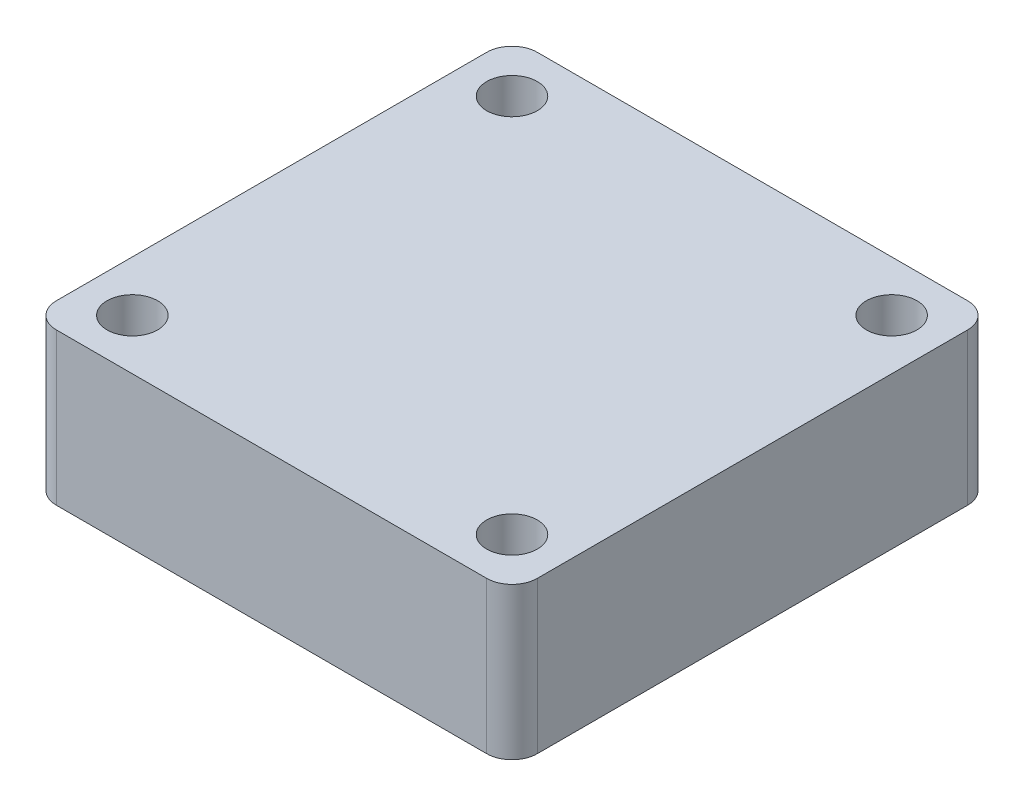
ISO-10303-21;
HEADER;
FILE_DESCRIPTION(('STEP AP214'),'2;1');
FILE_NAME('part.step','',(''),(''),'','','');
FILE_SCHEMA(('AUTOMOTIVE_DESIGN { 1 0 10303 214 1 1 1 1 }'));
ENDSEC;
DATA;
#1=APPLICATION_CONTEXT('core data for automotive mechanical design processes');
#2=APPLICATION_PROTOCOL_DEFINITION('international standard','automotive_design',2000,#1);
#3=PRODUCT_CONTEXT('',#1,'mechanical');
#4=PRODUCT('Part','Part','',(#3));
#5=PRODUCT_RELATED_PRODUCT_CATEGORY('part','',(#4));
#6=PRODUCT_DEFINITION_FORMATION('','',#4);
#7=PRODUCT_DEFINITION_CONTEXT('part definition',#1,'design');
#8=PRODUCT_DEFINITION('design','',#6,#7);
#9=PRODUCT_DEFINITION_SHAPE('','',#8);
#10=(LENGTH_UNIT() NAMED_UNIT(*) SI_UNIT(.MILLI.,.METRE.));
#11=(NAMED_UNIT(*) PLANE_ANGLE_UNIT() SI_UNIT($,.RADIAN.));
#12=(NAMED_UNIT(*) SI_UNIT($,.STERADIAN.) SOLID_ANGLE_UNIT());
#13=UNCERTAINTY_MEASURE_WITH_UNIT(LENGTH_MEASURE(1.E-05),#10,'distance_accuracy_value','');
#14=(GEOMETRIC_REPRESENTATION_CONTEXT(3) GLOBAL_UNCERTAINTY_ASSIGNED_CONTEXT((#13)) GLOBAL_UNIT_ASSIGNED_CONTEXT((#10,
#11,#12)) REPRESENTATION_CONTEXT('',''));
#15=CARTESIAN_POINT('',(0.,0.,0.));
#16=DIRECTION('',(0.,0.,1.));
#17=DIRECTION('',(1.,0.,0.));
#18=AXIS2_PLACEMENT_3D('',#15,#16,#17);
#19=CARTESIAN_POINT('',(0.,6.,0.));
#20=DIRECTION('',(0.,-1.,0.));
#21=DIRECTION('',(0.,0.,-1.));
#22=AXIS2_PLACEMENT_3D('',#19,#20,#21);
#23=PLANE('',#22);
#24=DIRECTION('',(1.,0.,0.));
#25=VECTOR('',#24,1.);
#26=CARTESIAN_POINT('',(0.,6.,0.));
#27=LINE('',#26,#25);
#28=CARTESIAN_POINT('',(1.,6.,0.));
#29=VERTEX_POINT('',#28);
#30=CARTESIAN_POINT('',(18.,6.,0.));
#31=VERTEX_POINT('',#30);
#32=EDGE_CURVE('E171',#29,#31,#27,.T.);
#33=ORIENTED_EDGE('',*,*,#32,.T.);
#34=CARTESIAN_POINT('',(18.,6.,-1.));
#35=DIRECTION('',(0.,-1.,0.));
#36=DIRECTION('',(0.,0.,-1.));
#37=AXIS2_PLACEMENT_3D('',#34,#35,#36);
#38=CIRCLE('',#37,1.);
#39=CARTESIAN_POINT('',(19.,6.,-1.));
#40=VERTEX_POINT('',#39);
#41=EDGE_CURVE('E149',#31,#40,#38,.F.);
#42=ORIENTED_EDGE('',*,*,#41,.T.);
#43=DIRECTION('',(0.,0.,-1.));
#44=VECTOR('',#43,1.);
#45=CARTESIAN_POINT('',(19.,6.,0.));
#46=LINE('',#45,#44);
#47=CARTESIAN_POINT('',(19.,6.,-18.));
#48=VERTEX_POINT('',#47);
#49=EDGE_CURVE('E119',#40,#48,#46,.T.);
#50=ORIENTED_EDGE('',*,*,#49,.T.);
#51=CARTESIAN_POINT('',(18.,6.,-18.));
#52=DIRECTION('',(0.,-1.,0.));
#53=DIRECTION('',(0.,0.,-1.));
#54=AXIS2_PLACEMENT_3D('',#51,#52,#53);
#55=CIRCLE('',#54,1.);
#56=CARTESIAN_POINT('',(18.,6.,-19.));
#57=VERTEX_POINT('',#56);
#58=EDGE_CURVE('E55',#48,#57,#55,.F.);
#59=ORIENTED_EDGE('',*,*,#58,.T.);
#60=DIRECTION('',(-1.,0.,0.));
#61=VECTOR('',#60,1.);
#62=CARTESIAN_POINT('',(0.,6.,-19.));
#63=LINE('',#62,#61);
#64=CARTESIAN_POINT('',(1.,6.,-19.));
#65=VERTEX_POINT('',#64);
#66=EDGE_CURVE('E135',#57,#65,#63,.T.);
#67=ORIENTED_EDGE('',*,*,#66,.T.);
#68=CARTESIAN_POINT('',(1.,6.,-18.));
#69=DIRECTION('',(0.,-1.,0.));
#70=DIRECTION('',(0.,0.,-1.));
#71=AXIS2_PLACEMENT_3D('',#68,#69,#70);
#72=CIRCLE('',#71,1.);
#73=CARTESIAN_POINT('',(0.,6.,-18.));
#74=VERTEX_POINT('',#73);
#75=EDGE_CURVE('E145',#65,#74,#72,.F.);
#76=ORIENTED_EDGE('',*,*,#75,.T.);
#77=DIRECTION('',(0.,0.,1.));
#78=VECTOR('',#77,1.);
#79=CARTESIAN_POINT('',(0.,6.,0.));
#80=LINE('',#79,#78);
#81=CARTESIAN_POINT('',(0.,6.,-1.));
#82=VERTEX_POINT('',#81);
#83=EDGE_CURVE('E129',#74,#82,#80,.T.);
#84=ORIENTED_EDGE('',*,*,#83,.T.);
#85=CARTESIAN_POINT('',(1.,6.,-1.));
#86=DIRECTION('',(0.,-1.,0.));
#87=DIRECTION('',(0.,0.,-1.));
#88=AXIS2_PLACEMENT_3D('',#85,#86,#87);
#89=CIRCLE('',#88,1.);
#90=EDGE_CURVE('E147',#82,#29,#89,.F.);
#91=ORIENTED_EDGE('',*,*,#90,.T.);
#92=EDGE_LOOP('',(#33,#42,#50,#59,#67,#76,#84,#91));
#93=FACE_BOUND('',#92,.T.);
#94=CARTESIAN_POINT('',(2.,6.,-17.));
#95=DIRECTION('',(0.,1.,0.));
#96=DIRECTION('',(0.,0.,1.));
#97=AXIS2_PLACEMENT_3D('',#94,#95,#96);
#98=CIRCLE('',#97,1.);
#99=CARTESIAN_POINT('',(2.,6.,-16.));
#100=VERTEX_POINT('',#99);
#101=EDGE_CURVE('E180',#100,#100,#98,.T.);
#102=ORIENTED_EDGE('',*,*,#101,.F.);
#103=EDGE_LOOP('',(#102));
#104=FACE_BOUND('',#103,.T.);
#105=CARTESIAN_POINT('',(17.,6.,-17.));
#106=DIRECTION('',(0.,1.,0.));
#107=DIRECTION('',(0.,0.,1.));
#108=AXIS2_PLACEMENT_3D('',#105,#106,#107);
#109=CIRCLE('',#108,0.999999999999998);
#110=CARTESIAN_POINT('',(17.,6.,-16.));
#111=VERTEX_POINT('',#110);
#112=EDGE_CURVE('E185',#111,#111,#109,.T.);
#113=ORIENTED_EDGE('',*,*,#112,.F.);
#114=EDGE_LOOP('',(#113));
#115=FACE_BOUND('',#114,.T.);
#116=CARTESIAN_POINT('',(17.,6.,-2.));
#117=DIRECTION('',(0.,1.,0.));
#118=DIRECTION('',(0.,0.,1.));
#119=AXIS2_PLACEMENT_3D('',#116,#117,#118);
#120=CIRCLE('',#119,0.999999999999998);
#121=CARTESIAN_POINT('',(17.,6.,-1.));
#122=VERTEX_POINT('',#121);
#123=EDGE_CURVE('E190',#122,#122,#120,.T.);
#124=ORIENTED_EDGE('',*,*,#123,.F.);
#125=EDGE_LOOP('',(#124));
#126=FACE_BOUND('',#125,.T.);
#127=CARTESIAN_POINT('',(2.,6.,-2.));
#128=DIRECTION('',(0.,1.,0.));
#129=DIRECTION('',(0.,0.,1.));
#130=AXIS2_PLACEMENT_3D('',#127,#128,#129);
#131=CIRCLE('',#130,1.);
#132=CARTESIAN_POINT('',(2.,6.,-1.));
#133=VERTEX_POINT('',#132);
#134=EDGE_CURVE('E196',#133,#133,#131,.T.);
#135=ORIENTED_EDGE('',*,*,#134,.F.);
#136=EDGE_LOOP('',(#135));
#137=FACE_BOUND('',#136,.T.);
#138=ADVANCED_FACE('F35',(#93,#104,#115,#126,#137),#23,.F.);
#139=CARTESIAN_POINT('',(0.,0.,0.));
#140=DIRECTION('',(0.,-1.,0.));
#141=DIRECTION('',(0.,0.,-1.));
#142=AXIS2_PLACEMENT_3D('',#139,#140,#141);
#143=PLANE('',#142);
#144=CARTESIAN_POINT('',(17.,0.,-2.));
#145=DIRECTION('',(0.,1.,0.));
#146=DIRECTION('',(0.,0.,1.));
#147=AXIS2_PLACEMENT_3D('',#144,#145,#146);
#148=CIRCLE('',#147,0.999999999999998);
#149=CARTESIAN_POINT('',(17.,0.,-1.));
#150=VERTEX_POINT('',#149);
#151=EDGE_CURVE('E193',#150,#150,#148,.T.);
#152=ORIENTED_EDGE('',*,*,#151,.T.);
#153=EDGE_LOOP('',(#152));
#154=FACE_BOUND('',#153,.T.);
#155=CARTESIAN_POINT('',(2.,0.,-17.));
#156=DIRECTION('',(0.,1.,0.));
#157=DIRECTION('',(0.,0.,1.));
#158=AXIS2_PLACEMENT_3D('',#155,#156,#157);
#159=CIRCLE('',#158,1.);
#160=CARTESIAN_POINT('',(2.,0.,-16.));
#161=VERTEX_POINT('',#160);
#162=EDGE_CURVE('E176',#161,#161,#159,.T.);
#163=ORIENTED_EDGE('',*,*,#162,.T.);
#164=EDGE_LOOP('',(#163));
#165=FACE_BOUND('',#164,.T.);
#166=DIRECTION('',(0.,0.,-1.));
#167=VECTOR('',#166,1.);
#168=CARTESIAN_POINT('',(19.,0.,0.));
#169=LINE('',#168,#167);
#170=CARTESIAN_POINT('',(19.,0.,-1.));
#171=VERTEX_POINT('',#170);
#172=CARTESIAN_POINT('',(19.,0.,-18.));
#173=VERTEX_POINT('',#172);
#174=EDGE_CURVE('E117',#171,#173,#169,.T.);
#175=ORIENTED_EDGE('',*,*,#174,.F.);
#176=CARTESIAN_POINT('',(18.,0.,-1.));
#177=DIRECTION('',(0.,-1.,0.));
#178=DIRECTION('',(0.,0.,-1.));
#179=AXIS2_PLACEMENT_3D('',#176,#177,#178);
#180=CIRCLE('',#179,1.);
#181=CARTESIAN_POINT('',(18.,0.,0.));
#182=VERTEX_POINT('',#181);
#183=EDGE_CURVE('E100',#171,#182,#180,.T.);
#184=ORIENTED_EDGE('',*,*,#183,.T.);
#185=DIRECTION('',(1.,0.,0.));
#186=VECTOR('',#185,1.);
#187=CARTESIAN_POINT('',(0.,0.,0.));
#188=LINE('',#187,#186);
#189=CARTESIAN_POINT('',(1.,0.,0.));
#190=VERTEX_POINT('',#189);
#191=EDGE_CURVE('E127',#190,#182,#188,.T.);
#192=ORIENTED_EDGE('',*,*,#191,.F.);
#193=CARTESIAN_POINT('',(1.,0.,-1.));
#194=DIRECTION('',(0.,-1.,0.));
#195=DIRECTION('',(0.,0.,-1.));
#196=AXIS2_PLACEMENT_3D('',#193,#194,#195);
#197=CIRCLE('',#196,1.);
#198=CARTESIAN_POINT('',(0.,0.,-1.));
#199=VERTEX_POINT('',#198);
#200=EDGE_CURVE('E111',#190,#199,#197,.T.);
#201=ORIENTED_EDGE('',*,*,#200,.T.);
#202=DIRECTION('',(0.,0.,1.));
#203=VECTOR('',#202,1.);
#204=CARTESIAN_POINT('',(0.,0.,0.));
#205=LINE('',#204,#203);
#206=CARTESIAN_POINT('',(0.,0.,-18.));
#207=VERTEX_POINT('',#206);
#208=EDGE_CURVE('E131',#207,#199,#205,.T.);
#209=ORIENTED_EDGE('',*,*,#208,.F.);
#210=CARTESIAN_POINT('',(1.,0.,-18.));
#211=DIRECTION('',(0.,-1.,0.));
#212=DIRECTION('',(0.,0.,-1.));
#213=AXIS2_PLACEMENT_3D('',#210,#211,#212);
#214=CIRCLE('',#213,1.);
#215=CARTESIAN_POINT('',(1.,0.,-19.));
#216=VERTEX_POINT('',#215);
#217=EDGE_CURVE('E138',#207,#216,#214,.T.);
#218=ORIENTED_EDGE('',*,*,#217,.T.);
#219=DIRECTION('',(-1.,0.,0.));
#220=VECTOR('',#219,1.);
#221=CARTESIAN_POINT('',(0.,0.,-19.));
#222=LINE('',#221,#220);
#223=CARTESIAN_POINT('',(18.,0.,-19.));
#224=VERTEX_POINT('',#223);
#225=EDGE_CURVE('E126',#224,#216,#222,.T.);
#226=ORIENTED_EDGE('',*,*,#225,.F.);
#227=CARTESIAN_POINT('',(18.,0.,-18.));
#228=DIRECTION('',(0.,-1.,0.));
#229=DIRECTION('',(0.,0.,-1.));
#230=AXIS2_PLACEMENT_3D('',#227,#228,#229);
#231=CIRCLE('',#230,1.);
#232=EDGE_CURVE('E120',#224,#173,#231,.T.);
#233=ORIENTED_EDGE('',*,*,#232,.T.);
#234=EDGE_LOOP('',(#175,#184,#192,#201,#209,#218,#226,#233));
#235=FACE_BOUND('',#234,.T.);
#236=CARTESIAN_POINT('',(17.,0.,-17.));
#237=DIRECTION('',(0.,1.,0.));
#238=DIRECTION('',(0.,0.,1.));
#239=AXIS2_PLACEMENT_3D('',#236,#237,#238);
#240=CIRCLE('',#239,0.999999999999998);
#241=CARTESIAN_POINT('',(17.,0.,-16.));
#242=VERTEX_POINT('',#241);
#243=EDGE_CURVE('E187',#242,#242,#240,.T.);
#244=ORIENTED_EDGE('',*,*,#243,.T.);
#245=EDGE_LOOP('',(#244));
#246=FACE_BOUND('',#245,.T.);
#247=CARTESIAN_POINT('',(2.,0.,-2.));
#248=DIRECTION('',(0.,1.,0.));
#249=DIRECTION('',(0.,0.,1.));
#250=AXIS2_PLACEMENT_3D('',#247,#248,#249);
#251=CIRCLE('',#250,1.);
#252=CARTESIAN_POINT('',(2.,0.,-1.));
#253=VERTEX_POINT('',#252);
#254=EDGE_CURVE('E199',#253,#253,#251,.T.);
#255=ORIENTED_EDGE('',*,*,#254,.T.);
#256=EDGE_LOOP('',(#255));
#257=FACE_BOUND('',#256,.T.);
#258=ADVANCED_FACE('F123',(#154,#165,#235,#246,#257),#143,.T.);
#259=CARTESIAN_POINT('',(0.,6.,0.));
#260=DIRECTION('',(1.,0.,0.));
#261=DIRECTION('',(0.,0.,-1.));
#262=AXIS2_PLACEMENT_3D('',#259,#260,#261);
#263=PLANE('',#262);
#264=ORIENTED_EDGE('',*,*,#208,.T.);
#265=DIRECTION('',(0.,-1.,0.));
#266=VECTOR('',#265,1.);
#267=CARTESIAN_POINT('',(0.,6.,-1.));
#268=LINE('',#267,#266);
#269=EDGE_CURVE('E154',#199,#82,#268,.F.);
#270=ORIENTED_EDGE('',*,*,#269,.T.);
#271=ORIENTED_EDGE('',*,*,#83,.F.);
#272=DIRECTION('',(0.,-1.,0.));
#273=VECTOR('',#272,1.);
#274=CARTESIAN_POINT('',(0.,6.,-18.));
#275=LINE('',#274,#273);
#276=EDGE_CURVE('E151',#74,#207,#275,.T.);
#277=ORIENTED_EDGE('',*,*,#276,.T.);
#278=EDGE_LOOP('',(#264,#270,#271,#277));
#279=FACE_BOUND('',#278,.T.);
#280=ADVANCED_FACE('F167',(#279),#263,.F.);
#281=CARTESIAN_POINT('',(0.,6.,0.));
#282=DIRECTION('',(0.,0.,-1.));
#283=DIRECTION('',(-1.,0.,0.));
#284=AXIS2_PLACEMENT_3D('',#281,#282,#283);
#285=PLANE('',#284);
#286=ORIENTED_EDGE('',*,*,#191,.T.);
#287=DIRECTION('',(0.,-1.,0.));
#288=VECTOR('',#287,1.);
#289=CARTESIAN_POINT('',(18.,6.,0.));
#290=LINE('',#289,#288);
#291=EDGE_CURVE('E105',#182,#31,#290,.F.);
#292=ORIENTED_EDGE('',*,*,#291,.T.);
#293=ORIENTED_EDGE('',*,*,#32,.F.);
#294=DIRECTION('',(0.,-1.,0.));
#295=VECTOR('',#294,1.);
#296=CARTESIAN_POINT('',(1.,6.,0.));
#297=LINE('',#296,#295);
#298=EDGE_CURVE('E110',#29,#190,#297,.T.);
#299=ORIENTED_EDGE('',*,*,#298,.T.);
#300=EDGE_LOOP('',(#286,#292,#293,#299));
#301=FACE_BOUND('',#300,.T.);
#302=ADVANCED_FACE('F224',(#301),#285,.F.);
#303=CARTESIAN_POINT('',(19.,6.,0.));
#304=DIRECTION('',(-1.,0.,0.));
#305=DIRECTION('',(0.,0.,1.));
#306=AXIS2_PLACEMENT_3D('',#303,#304,#305);
#307=PLANE('',#306);
#308=ORIENTED_EDGE('',*,*,#49,.F.);
#309=DIRECTION('',(0.,-1.,0.));
#310=VECTOR('',#309,1.);
#311=CARTESIAN_POINT('',(19.,6.,-1.));
#312=LINE('',#311,#310);
#313=EDGE_CURVE('E104',#40,#171,#312,.T.);
#314=ORIENTED_EDGE('',*,*,#313,.T.);
#315=ORIENTED_EDGE('',*,*,#174,.T.);
#316=DIRECTION('',(0.,-1.,0.));
#317=VECTOR('',#316,1.);
#318=CARTESIAN_POINT('',(19.,6.,-18.));
#319=LINE('',#318,#317);
#320=EDGE_CURVE('E121',#173,#48,#319,.F.);
#321=ORIENTED_EDGE('',*,*,#320,.T.);
#322=EDGE_LOOP('',(#308,#314,#315,#321));
#323=FACE_BOUND('',#322,.T.);
#324=ADVANCED_FACE('F116',(#323),#307,.F.);
#325=CARTESIAN_POINT('',(0.,6.,-19.));
#326=DIRECTION('',(0.,0.,1.));
#327=DIRECTION('',(1.,0.,0.));
#328=AXIS2_PLACEMENT_3D('',#325,#326,#327);
#329=PLANE('',#328);
#330=ORIENTED_EDGE('',*,*,#225,.T.);
#331=DIRECTION('',(0.,-1.,0.));
#332=VECTOR('',#331,1.);
#333=CARTESIAN_POINT('',(1.,6.,-19.));
#334=LINE('',#333,#332);
#335=EDGE_CURVE('E11',#216,#65,#334,.F.);
#336=ORIENTED_EDGE('',*,*,#335,.T.);
#337=ORIENTED_EDGE('',*,*,#66,.F.);
#338=DIRECTION('',(0.,-1.,0.));
#339=VECTOR('',#338,1.);
#340=CARTESIAN_POINT('',(18.,6.,-19.));
#341=LINE('',#340,#339);
#342=EDGE_CURVE('E43',#57,#224,#341,.T.);
#343=ORIENTED_EDGE('',*,*,#342,.T.);
#344=EDGE_LOOP('',(#330,#336,#337,#343));
#345=FACE_BOUND('',#344,.T.);
#346=ADVANCED_FACE('F157',(#345),#329,.F.);
#347=CARTESIAN_POINT('',(2.,6.,-17.));
#348=DIRECTION('',(0.,-1.,0.));
#349=DIRECTION('',(0.,0.,-1.));
#350=AXIS2_PLACEMENT_3D('',#347,#348,#349);
#351=CYLINDRICAL_SURFACE('',#350,1.);
#352=ORIENTED_EDGE('',*,*,#101,.T.);
#353=EDGE_LOOP('',(#352));
#354=FACE_BOUND('',#353,.T.);
#355=ORIENTED_EDGE('',*,*,#162,.F.);
#356=EDGE_LOOP('',(#355));
#357=FACE_BOUND('',#356,.T.);
#358=ADVANCED_FACE('F217',(#354,#357),#351,.F.);
#359=CARTESIAN_POINT('',(17.,6.,-17.));
#360=DIRECTION('',(0.,-1.,0.));
#361=DIRECTION('',(0.,0.,-1.));
#362=AXIS2_PLACEMENT_3D('',#359,#360,#361);
#363=CYLINDRICAL_SURFACE('',#362,0.999999999999998);
#364=ORIENTED_EDGE('',*,*,#112,.T.);
#365=EDGE_LOOP('',(#364));
#366=FACE_BOUND('',#365,.T.);
#367=ORIENTED_EDGE('',*,*,#243,.F.);
#368=EDGE_LOOP('',(#367));
#369=FACE_BOUND('',#368,.T.);
#370=ADVANCED_FACE('F313',(#366,#369),#363,.F.);
#371=CARTESIAN_POINT('',(17.,6.,-2.));
#372=DIRECTION('',(0.,-1.,0.));
#373=DIRECTION('',(0.,0.,-1.));
#374=AXIS2_PLACEMENT_3D('',#371,#372,#373);
#375=CYLINDRICAL_SURFACE('',#374,0.999999999999998);
#376=ORIENTED_EDGE('',*,*,#123,.T.);
#377=EDGE_LOOP('',(#376));
#378=FACE_BOUND('',#377,.T.);
#379=ORIENTED_EDGE('',*,*,#151,.F.);
#380=EDGE_LOOP('',(#379));
#381=FACE_BOUND('',#380,.T.);
#382=ADVANCED_FACE('F304',(#378,#381),#375,.F.);
#383=CARTESIAN_POINT('',(2.,6.,-2.));
#384=DIRECTION('',(0.,-1.,0.));
#385=DIRECTION('',(0.,0.,-1.));
#386=AXIS2_PLACEMENT_3D('',#383,#384,#385);
#387=CYLINDRICAL_SURFACE('',#386,1.);
#388=ORIENTED_EDGE('',*,*,#134,.T.);
#389=EDGE_LOOP('',(#388));
#390=FACE_BOUND('',#389,.T.);
#391=ORIENTED_EDGE('',*,*,#254,.F.);
#392=EDGE_LOOP('',(#391));
#393=FACE_BOUND('',#392,.T.);
#394=ADVANCED_FACE('F205',(#390,#393),#387,.F.);
#395=CARTESIAN_POINT('',(18.,6.,-1.));
#396=DIRECTION('',(0.,-1.,0.));
#397=DIRECTION('',(0.,0.,-1.));
#398=AXIS2_PLACEMENT_3D('',#395,#396,#397);
#399=CYLINDRICAL_SURFACE('',#398,1.);
#400=ORIENTED_EDGE('',*,*,#41,.F.);
#401=ORIENTED_EDGE('',*,*,#291,.F.);
#402=ORIENTED_EDGE('',*,*,#183,.F.);
#403=ORIENTED_EDGE('',*,*,#313,.F.);
#404=EDGE_LOOP('',(#400,#401,#402,#403));
#405=FACE_BOUND('',#404,.T.);
#406=ADVANCED_FACE('F103',(#405),#399,.T.);
#407=CARTESIAN_POINT('',(1.,6.,-1.));
#408=DIRECTION('',(0.,-1.,0.));
#409=DIRECTION('',(0.,0.,-1.));
#410=AXIS2_PLACEMENT_3D('',#407,#408,#409);
#411=CYLINDRICAL_SURFACE('',#410,1.);
#412=ORIENTED_EDGE('',*,*,#90,.F.);
#413=ORIENTED_EDGE('',*,*,#269,.F.);
#414=ORIENTED_EDGE('',*,*,#200,.F.);
#415=ORIENTED_EDGE('',*,*,#298,.F.);
#416=EDGE_LOOP('',(#412,#413,#414,#415));
#417=FACE_BOUND('',#416,.T.);
#418=ADVANCED_FACE('F232',(#417),#411,.T.);
#419=CARTESIAN_POINT('',(1.,6.,-18.));
#420=DIRECTION('',(0.,-1.,0.));
#421=DIRECTION('',(0.,0.,-1.));
#422=AXIS2_PLACEMENT_3D('',#419,#420,#421);
#423=CYLINDRICAL_SURFACE('',#422,1.);
#424=ORIENTED_EDGE('',*,*,#75,.F.);
#425=ORIENTED_EDGE('',*,*,#335,.F.);
#426=ORIENTED_EDGE('',*,*,#217,.F.);
#427=ORIENTED_EDGE('',*,*,#276,.F.);
#428=EDGE_LOOP('',(#424,#425,#426,#427));
#429=FACE_BOUND('',#428,.T.);
#430=ADVANCED_FACE('F164',(#429),#423,.T.);
#431=CARTESIAN_POINT('',(18.,6.,-18.));
#432=DIRECTION('',(0.,-1.,0.));
#433=DIRECTION('',(0.,0.,-1.));
#434=AXIS2_PLACEMENT_3D('',#431,#432,#433);
#435=CYLINDRICAL_SURFACE('',#434,1.);
#436=ORIENTED_EDGE('',*,*,#58,.F.);
#437=ORIENTED_EDGE('',*,*,#320,.F.);
#438=ORIENTED_EDGE('',*,*,#232,.F.);
#439=ORIENTED_EDGE('',*,*,#342,.F.);
#440=EDGE_LOOP('',(#436,#437,#438,#439));
#441=FACE_BOUND('',#440,.T.);
#442=ADVANCED_FACE('F37',(#441),#435,.T.);
#443=CLOSED_SHELL('',(#138,#258,#280,#302,#324,#346,#358,#370,#382,#394,#406,#418,#430,#442));
#444=MANIFOLD_SOLID_BREP('B2',#443);
#445=ADVANCED_BREP_SHAPE_REPRESENTATION('',(#18,#444),#14);
#446=SHAPE_DEFINITION_REPRESENTATION(#9,#445);
ENDSEC;
END-ISO-10303-21;
